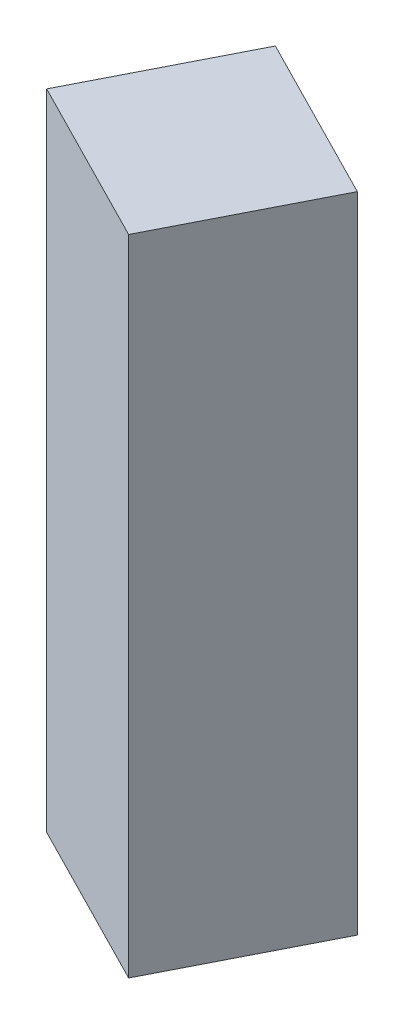
ISO-10303-21;
HEADER;
FILE_DESCRIPTION(('STEP AP214'),'2;1');
FILE_NAME('part.step','',(''),(''),'','','');
FILE_SCHEMA(('AUTOMOTIVE_DESIGN { 1 0 10303 214 1 1 1 1 }'));
ENDSEC;
DATA;
#1=APPLICATION_CONTEXT('core data for automotive mechanical design processes');
#2=APPLICATION_PROTOCOL_DEFINITION('international standard','automotive_design',2000,#1);
#3=PRODUCT_CONTEXT('',#1,'mechanical');
#4=PRODUCT('Part','Part','',(#3));
#5=PRODUCT_RELATED_PRODUCT_CATEGORY('part','',(#4));
#6=PRODUCT_DEFINITION_FORMATION('','',#4);
#7=PRODUCT_DEFINITION_CONTEXT('part definition',#1,'design');
#8=PRODUCT_DEFINITION('design','',#6,#7);
#9=PRODUCT_DEFINITION_SHAPE('','',#8);
#10=(LENGTH_UNIT() NAMED_UNIT(*) SI_UNIT(.MILLI.,.METRE.));
#11=(NAMED_UNIT(*) PLANE_ANGLE_UNIT() SI_UNIT($,.RADIAN.));
#12=(NAMED_UNIT(*) SI_UNIT($,.STERADIAN.) SOLID_ANGLE_UNIT());
#13=UNCERTAINTY_MEASURE_WITH_UNIT(LENGTH_MEASURE(1.E-05),#10,'distance_accuracy_value','');
#14=(GEOMETRIC_REPRESENTATION_CONTEXT(3) GLOBAL_UNCERTAINTY_ASSIGNED_CONTEXT((#13)) GLOBAL_UNIT_ASSIGNED_CONTEXT((#10,
#11,#12)) REPRESENTATION_CONTEXT('',''));
#15=CARTESIAN_POINT('',(0.,0.,0.));
#16=DIRECTION('',(0.,0.,1.));
#17=DIRECTION('',(1.,0.,0.));
#18=AXIS2_PLACEMENT_3D('',#15,#16,#17);
#19=CARTESIAN_POINT('',(95.9641873194,41.8789091554,81.4122723288));
#20=DIRECTION('',(0.891006526286007,0.,0.453990495622699));
#21=DIRECTION('',(0.453990495622699,0.,-0.891006526286007));
#22=AXIS2_PLACEMENT_3D('',#19,#20,#21);
#23=PLANE('',#22);
#24=DIRECTION('',(-0.453990495622699,0.,0.891006526286007));
#25=VECTOR('',#24,1.);
#26=CARTESIAN_POINT('',(96.2616843495,46.8419278552,80.8284015255));
#27=LINE('',#26,#25);
#28=CARTESIAN_POINT('',(96.5591813796,46.8419278552,80.2445307222));
#29=VERTEX_POINT('',#28);
#30=CARTESIAN_POINT('',(95.9641873194,46.8419278552,81.4122723288));
#31=VERTEX_POINT('',#30);
#32=EDGE_CURVE('E61',#29,#31,#27,.T.);
#33=ORIENTED_EDGE('',*,*,#32,.T.);
#34=DIRECTION('',(0.,1.,0.));
#35=VECTOR('',#34,1.);
#36=CARTESIAN_POINT('',(95.9641873194,44.3604185053,81.4122723288));
#37=LINE('',#36,#35);
#38=CARTESIAN_POINT('',(95.9641873203389,41.8789091554,81.4122723302933));
#39=VERTEX_POINT('',#38);
#40=EDGE_CURVE('E81',#39,#31,#37,.T.);
#41=ORIENTED_EDGE('',*,*,#40,.F.);
#42=DIRECTION('',(0.453990495622699,0.,-0.891006526286007));
#43=VECTOR('',#42,1.);
#44=CARTESIAN_POINT('',(96.2616843495,41.8789091554,80.8284015255));
#45=LINE('',#44,#43);
#46=CARTESIAN_POINT('',(96.5591813813543,41.8789091554,80.2445307258208));
#47=VERTEX_POINT('',#46);
#48=EDGE_CURVE('E84',#39,#47,#45,.T.);
#49=ORIENTED_EDGE('',*,*,#48,.T.);
#50=DIRECTION('',(0.,-1.,0.));
#51=VECTOR('',#50,1.);
#52=CARTESIAN_POINT('',(96.5591813796,44.3604185053,80.2445307222));
#53=LINE('',#52,#51);
#54=EDGE_CURVE('E65',#29,#47,#53,.T.);
#55=ORIENTED_EDGE('',*,*,#54,.F.);
#56=EDGE_LOOP('',(#33,#41,#49,#55));
#57=FACE_BOUND('',#56,.T.);
#58=ADVANCED_FACE('F17',(#57),#23,.T.);
#59=CARTESIAN_POINT('',(94.676318267,41.8789091554,80.7560702884));
#60=DIRECTION('',(-0.453990490174854,0.,0.891006529061822));
#61=DIRECTION('',(0.891006529061822,0.,0.453990490174854));
#62=AXIS2_PLACEMENT_3D('',#59,#60,#61);
#63=PLANE('',#62);
#64=DIRECTION('',(-0.891006529061822,0.,-0.453990490174854));
#65=VECTOR('',#64,1.);
#66=CARTESIAN_POINT('',(95.3202527932,46.8419278552,81.0841713086));
#67=LINE('',#66,#65);
#68=CARTESIAN_POINT('',(94.676318267,46.8419278552,80.7560702884));
#69=VERTEX_POINT('',#68);
#70=EDGE_CURVE('E78',#31,#69,#67,.T.);
#71=ORIENTED_EDGE('',*,*,#70,.T.);
#72=DIRECTION('',(0.,1.,0.));
#73=VECTOR('',#72,1.);
#74=CARTESIAN_POINT('',(94.676318267,44.3604185053,80.7560702884));
#75=LINE('',#74,#73);
#76=CARTESIAN_POINT('',(94.6763182738033,41.8789091554,80.7560702918665));
#77=VERTEX_POINT('',#76);
#78=EDGE_CURVE('E73',#77,#69,#75,.T.);
#79=ORIENTED_EDGE('',*,*,#78,.F.);
#80=DIRECTION('',(0.891006529061822,0.,0.453990490174854));
#81=VECTOR('',#80,1.);
#82=CARTESIAN_POINT('',(95.3202527932,41.8789091554,81.0841713086));
#83=LINE('',#82,#81);
#84=EDGE_CURVE('E31',#77,#39,#83,.T.);
#85=ORIENTED_EDGE('',*,*,#84,.T.);
#86=ORIENTED_EDGE('',*,*,#40,.T.);
#87=EDGE_LOOP('',(#71,#79,#85,#86));
#88=FACE_BOUND('',#87,.T.);
#89=ADVANCED_FACE('F89',(#88),#63,.T.);
#90=CARTESIAN_POINT('',(96.5591813796,46.8419278552,80.2445307222));
#91=DIRECTION('',(0.,-1.,0.));
#92=DIRECTION('',(-0.453990495622699,0.,0.891006526286007));
#93=AXIS2_PLACEMENT_3D('',#90,#91,#92);
#94=PLANE('',#93);
#95=ORIENTED_EDGE('',*,*,#32,.F.);
#96=DIRECTION('',(0.891006525439934,0.,0.45399049728321));
#97=VECTOR('',#96,1.);
#98=CARTESIAN_POINT('',(95.9152468661,46.8419278552,79.916429702));
#99=LINE('',#98,#97);
#100=CARTESIAN_POINT('',(95.2713123526,46.8419278552,79.5883286818));
#101=VERTEX_POINT('',#100);
#102=EDGE_CURVE('E54',#101,#29,#99,.T.);
#103=ORIENTED_EDGE('',*,*,#102,.F.);
#104=DIRECTION('',(0.45399051100885,0.,-0.891006518446371));
#105=VECTOR('',#104,1.);
#106=CARTESIAN_POINT('',(94.9738153098,46.8419278552,80.1721994851));
#107=LINE('',#106,#105);
#108=EDGE_CURVE('E59',#69,#101,#107,.T.);
#109=ORIENTED_EDGE('',*,*,#108,.F.);
#110=ORIENTED_EDGE('',*,*,#70,.F.);
#111=EDGE_LOOP('',(#95,#103,#109,#110));
#112=FACE_BOUND('',#111,.T.);
#113=ADVANCED_FACE('F56',(#112),#94,.F.);
#114=CARTESIAN_POINT('',(96.5591813796,41.8789091554,80.2445307222));
#115=DIRECTION('',(0.45399049728321,0.,-0.891006525439934));
#116=DIRECTION('',(-0.891006525439934,0.,-0.45399049728321));
#117=AXIS2_PLACEMENT_3D('',#114,#115,#116);
#118=PLANE('',#117);
#119=ORIENTED_EDGE('',*,*,#102,.T.);
#120=ORIENTED_EDGE('',*,*,#54,.T.);
#121=DIRECTION('',(-0.891006525439934,0.,-0.45399049728321));
#122=VECTOR('',#121,1.);
#123=CARTESIAN_POINT('',(95.9152468661,41.8789091554,79.916429702));
#124=LINE('',#123,#122);
#125=CARTESIAN_POINT('',(95.2713123512506,41.8789091554,79.5883286811125));
#126=VERTEX_POINT('',#125);
#127=EDGE_CURVE('E66',#47,#126,#124,.T.);
#128=ORIENTED_EDGE('',*,*,#127,.T.);
#129=DIRECTION('',(0.,-1.,0.));
#130=VECTOR('',#129,1.);
#131=CARTESIAN_POINT('',(95.2713123526,44.3604185053,79.5883286818));
#132=LINE('',#131,#130);
#133=EDGE_CURVE('E26',#101,#126,#132,.T.);
#134=ORIENTED_EDGE('',*,*,#133,.F.);
#135=EDGE_LOOP('',(#119,#120,#128,#134));
#136=FACE_BOUND('',#135,.T.);
#137=ADVANCED_FACE('F69',(#136),#118,.T.);
#138=CARTESIAN_POINT('',(95.2713123526,41.8789091554,79.5883286818));
#139=DIRECTION('',(-0.891006518446371,0.,-0.45399051100885));
#140=DIRECTION('',(-0.45399051100885,0.,0.891006518446371));
#141=AXIS2_PLACEMENT_3D('',#138,#139,#140);
#142=PLANE('',#141);
#143=ORIENTED_EDGE('',*,*,#108,.T.);
#144=ORIENTED_EDGE('',*,*,#133,.T.);
#145=DIRECTION('',(0.453990498567509,0.,-0.891006524785551));
#146=VECTOR('',#145,1.);
#147=CARTESIAN_POINT('',(94.676318288048,41.8789091554,80.7560702807286));
#148=LINE('',#147,#146);
#149=EDGE_CURVE('E11',#77,#126,#148,.T.);
#150=ORIENTED_EDGE('',*,*,#149,.F.);
#151=ORIENTED_EDGE('',*,*,#78,.T.);
#152=EDGE_LOOP('',(#143,#144,#150,#151));
#153=FACE_BOUND('',#152,.T.);
#154=ADVANCED_FACE('F72',(#153),#142,.T.);
#155=CARTESIAN_POINT('',(94.665021109,41.8789091554,81.423215995));
#156=DIRECTION('',(0.,-1.,0.));
#157=DIRECTION('',(0.,0.,-1.));
#158=AXIS2_PLACEMENT_3D('',#155,#156,#157);
#159=PLANE('',#158);
#160=ORIENTED_EDGE('',*,*,#84,.F.);
#161=ORIENTED_EDGE('',*,*,#149,.T.);
#162=ORIENTED_EDGE('',*,*,#127,.F.);
#163=ORIENTED_EDGE('',*,*,#48,.F.);
#164=EDGE_LOOP('',(#160,#161,#162,#163));
#165=FACE_BOUND('',#164,.T.);
#166=ADVANCED_FACE('F19',(#165),#159,.T.);
#167=CLOSED_SHELL('',(#58,#89,#113,#137,#154,#166));
#168=MANIFOLD_SOLID_BREP('B1',#167);
#169=ADVANCED_BREP_SHAPE_REPRESENTATION('',(#18,#168),#14);
#170=SHAPE_DEFINITION_REPRESENTATION(#9,#169);
ENDSEC;
END-ISO-10303-21;
